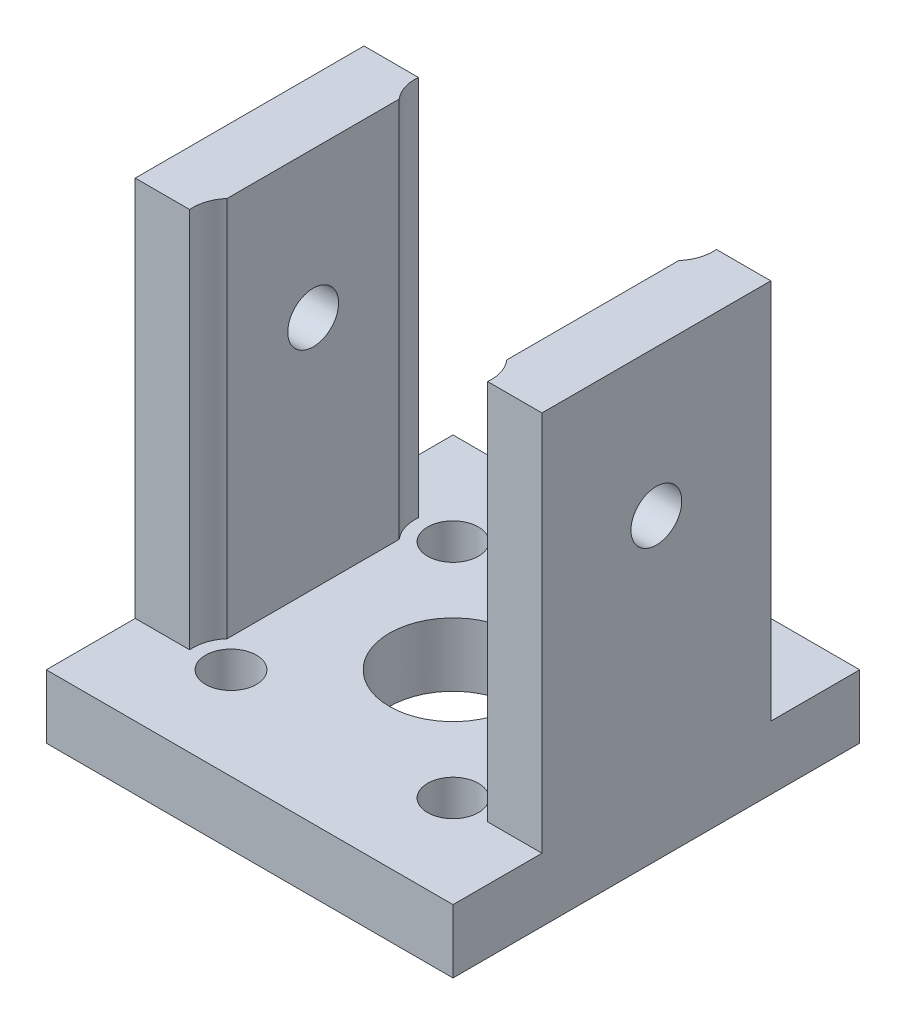
ISO-10303-21;
HEADER;
FILE_DESCRIPTION(('STEP AP214'),'2;1');
FILE_NAME('part.step','',(''),(''),'','','');
FILE_SCHEMA(('AUTOMOTIVE_DESIGN { 1 0 10303 214 1 1 1 1 }'));
ENDSEC;
DATA;
#1=APPLICATION_CONTEXT('core data for automotive mechanical design processes');
#2=APPLICATION_PROTOCOL_DEFINITION('international standard','automotive_design',2000,#1);
#3=PRODUCT_CONTEXT('',#1,'mechanical');
#4=PRODUCT('Part','Part','',(#3));
#5=PRODUCT_RELATED_PRODUCT_CATEGORY('part','',(#4));
#6=PRODUCT_DEFINITION_FORMATION('','',#4);
#7=PRODUCT_DEFINITION_CONTEXT('part definition',#1,'design');
#8=PRODUCT_DEFINITION('design','',#6,#7);
#9=PRODUCT_DEFINITION_SHAPE('','',#8);
#10=(LENGTH_UNIT() NAMED_UNIT(*) SI_UNIT(.MILLI.,.METRE.));
#11=(NAMED_UNIT(*) PLANE_ANGLE_UNIT() SI_UNIT($,.RADIAN.));
#12=(NAMED_UNIT(*) SI_UNIT($,.STERADIAN.) SOLID_ANGLE_UNIT());
#13=UNCERTAINTY_MEASURE_WITH_UNIT(LENGTH_MEASURE(1.E-05),#10,'distance_accuracy_value','');
#14=(GEOMETRIC_REPRESENTATION_CONTEXT(3) GLOBAL_UNCERTAINTY_ASSIGNED_CONTEXT((#13)) GLOBAL_UNIT_ASSIGNED_CONTEXT((#10,
#11,#12)) REPRESENTATION_CONTEXT('',''));
#15=CARTESIAN_POINT('',(0.,0.,0.));
#16=DIRECTION('',(0.,0.,1.));
#17=DIRECTION('',(1.,0.,0.));
#18=AXIS2_PLACEMENT_3D('',#15,#16,#17);
#19=CARTESIAN_POINT('',(0.,5.,0.));
#20=DIRECTION('',(0.,1.,0.));
#21=DIRECTION('',(0.,0.,1.));
#22=AXIS2_PLACEMENT_3D('',#19,#20,#21);
#23=PLANE('',#22);
#24=CARTESIAN_POINT('',(8.73276874765368,5.,7.26723125234616));
#25=DIRECTION('',(0.,1.,0.));
#26=DIRECTION('',(0.,0.,1.));
#27=AXIS2_PLACEMENT_3D('',#24,#25,#26);
#28=CIRCLE('',#27,2.00000000000035);
#29=CARTESIAN_POINT('',(8.73276874765368,5.,9.26723125234651));
#30=VERTEX_POINT('',#29);
#31=EDGE_CURVE('E564',#30,#30,#28,.T.);
#32=ORIENTED_EDGE('',*,*,#31,.F.);
#33=EDGE_LOOP('',(#32));
#34=FACE_BOUND('',#33,.T.);
#35=CARTESIAN_POINT('',(8.73276874765391,5.,24.7327687476539));
#36=DIRECTION('',(0.,1.,0.));
#37=DIRECTION('',(0.,0.,1.));
#38=AXIS2_PLACEMENT_3D('',#35,#36,#37);
#39=CIRCLE('',#38,2.);
#40=CARTESIAN_POINT('',(8.73276874765391,5.,26.7327687476539));
#41=VERTEX_POINT('',#40);
#42=EDGE_CURVE('E561',#41,#41,#39,.T.);
#43=ORIENTED_EDGE('',*,*,#42,.F.);
#44=EDGE_LOOP('',(#43));
#45=FACE_BOUND('',#44,.T.);
#46=CARTESIAN_POINT('',(-8.73276874765385,5.,24.7327687476538));
#47=DIRECTION('',(0.,1.,0.));
#48=DIRECTION('',(0.,0.,1.));
#49=AXIS2_PLACEMENT_3D('',#46,#47,#48);
#50=CIRCLE('',#49,2.);
#51=CARTESIAN_POINT('',(-8.73276874765385,5.,26.7327687476538));
#52=VERTEX_POINT('',#51);
#53=EDGE_CURVE('E558',#52,#52,#50,.T.);
#54=ORIENTED_EDGE('',*,*,#53,.F.);
#55=EDGE_LOOP('',(#54));
#56=FACE_BOUND('',#55,.T.);
#57=CARTESIAN_POINT('',(-8.73276874765404,5.,7.26723125234639));
#58=DIRECTION('',(0.,1.,0.));
#59=DIRECTION('',(0.,0.,1.));
#60=AXIS2_PLACEMENT_3D('',#57,#58,#59);
#61=CIRCLE('',#60,2.00000000000041);
#62=CARTESIAN_POINT('',(-8.73276874765404,5.,9.2672312523468));
#63=VERTEX_POINT('',#62);
#64=EDGE_CURVE('E555',#63,#63,#61,.T.);
#65=ORIENTED_EDGE('',*,*,#64,.F.);
#66=EDGE_LOOP('',(#65));
#67=FACE_BOUND('',#66,.T.);
#68=CARTESIAN_POINT('',(0.,5.,16.));
#69=DIRECTION('',(0.,1.,0.));
#70=DIRECTION('',(0.,0.,1.));
#71=AXIS2_PLACEMENT_3D('',#68,#69,#70);
#72=CIRCLE('',#71,5.);
#73=CARTESIAN_POINT('',(0.,5.,21.));
#74=VERTEX_POINT('',#73);
#75=EDGE_CURVE('E552',#74,#74,#72,.T.);
#76=ORIENTED_EDGE('',*,*,#75,.F.);
#77=EDGE_LOOP('',(#76));
#78=FACE_BOUND('',#77,.T.);
#79=DIRECTION('',(0.,0.,-1.));
#80=VECTOR('',#79,1.);
#81=CARTESIAN_POINT('',(16.,5.,0.));
#82=LINE('',#81,#80);
#83=CARTESIAN_POINT('',(16.,5.,32.));
#84=VERTEX_POINT('',#83);
#85=CARTESIAN_POINT('',(16.,5.,25.));
#86=VERTEX_POINT('',#85);
#87=EDGE_CURVE('E229',#84,#86,#82,.T.);
#88=ORIENTED_EDGE('',*,*,#87,.T.);
#89=DIRECTION('',(1.,0.,0.));
#90=VECTOR('',#89,1.);
#91=CARTESIAN_POINT('',(16.,5.,25.));
#92=LINE('',#91,#90);
#93=CARTESIAN_POINT('',(11.7257011928435,5.,25.));
#94=VERTEX_POINT('',#93);
#95=EDGE_CURVE('E579',#94,#86,#92,.T.);
#96=ORIENTED_EDGE('',*,*,#95,.F.);
#97=CARTESIAN_POINT('',(8.73723125234614,5.,24.7372312523464));
#98=DIRECTION('',(0.,-1.,0.));
#99=DIRECTION('',(0.,0.,1.));
#100=AXIS2_PLACEMENT_3D('',#97,#98,#99);
#101=CIRCLE('',#100,3.);
#102=CARTESIAN_POINT('',(11.,5.,22.7674907631852));
#103=VERTEX_POINT('',#102);
#104=EDGE_CURVE('E577',#103,#94,#101,.T.);
#105=ORIENTED_EDGE('',*,*,#104,.F.);
#106=DIRECTION('',(0.,0.,1.));
#107=VECTOR('',#106,1.);
#108=CARTESIAN_POINT('',(11.,5.,9.23697174150738));
#109=LINE('',#108,#107);
#110=CARTESIAN_POINT('',(11.,5.,9.23697174150738));
#111=VERTEX_POINT('',#110);
#112=EDGE_CURVE('E575',#111,#103,#109,.T.);
#113=ORIENTED_EDGE('',*,*,#112,.F.);
#114=CARTESIAN_POINT('',(8.73723125234596,5.,7.26723125234639));
#115=DIRECTION('',(0.,-1.,0.));
#116=DIRECTION('',(0.,0.,1.));
#117=AXIS2_PLACEMENT_3D('',#114,#115,#116);
#118=CIRCLE('',#117,3.);
#119=CARTESIAN_POINT('',(11.7253054578786,5.,7.));
#120=VERTEX_POINT('',#119);
#121=EDGE_CURVE('E172',#120,#111,#118,.T.);
#122=ORIENTED_EDGE('',*,*,#121,.F.);
#123=DIRECTION('',(-1.,0.,0.));
#124=VECTOR('',#123,1.);
#125=CARTESIAN_POINT('',(16.,5.,7.));
#126=LINE('',#125,#124);
#127=CARTESIAN_POINT('',(16.,5.,7.));
#128=VERTEX_POINT('',#127);
#129=EDGE_CURVE('E168',#128,#120,#126,.T.);
#130=ORIENTED_EDGE('',*,*,#129,.F.);
#131=CARTESIAN_POINT('',(16.,5.,0.));
#132=VERTEX_POINT('',#131);
#133=EDGE_CURVE('E228',#128,#132,#82,.T.);
#134=ORIENTED_EDGE('',*,*,#133,.T.);
#135=DIRECTION('',(-1.,0.,0.));
#136=VECTOR('',#135,1.);
#137=CARTESIAN_POINT('',(-16.,5.,0.));
#138=LINE('',#137,#136);
#139=CARTESIAN_POINT('',(-16.,5.,0.));
#140=VERTEX_POINT('',#139);
#141=EDGE_CURVE('E232',#132,#140,#138,.T.);
#142=ORIENTED_EDGE('',*,*,#141,.T.);
#143=DIRECTION('',(0.,0.,1.));
#144=VECTOR('',#143,1.);
#145=CARTESIAN_POINT('',(-16.,5.,0.));
#146=LINE('',#145,#144);
#147=CARTESIAN_POINT('',(-16.,5.,7.));
#148=VERTEX_POINT('',#147);
#149=EDGE_CURVE('E223',#140,#148,#146,.T.);
#150=ORIENTED_EDGE('',*,*,#149,.T.);
#151=DIRECTION('',(-1.,0.,0.));
#152=VECTOR('',#151,1.);
#153=CARTESIAN_POINT('',(-16.,5.,7.));
#154=LINE('',#153,#152);
#155=CARTESIAN_POINT('',(-11.7208429531867,5.,7.));
#156=VERTEX_POINT('',#155);
#157=EDGE_CURVE('E59',#156,#148,#154,.T.);
#158=ORIENTED_EDGE('',*,*,#157,.F.);
#159=CARTESIAN_POINT('',(-8.73276874765398,5.,7.26723125234672));
#160=DIRECTION('',(0.,-1.,0.));
#161=DIRECTION('',(0.,0.,1.));
#162=AXIS2_PLACEMENT_3D('',#159,#160,#161);
#163=CIRCLE('',#162,2.99999999999996);
#164=CARTESIAN_POINT('',(-11.0000000000001,5.,9.2318336162832));
#165=VERTEX_POINT('',#164);
#166=EDGE_CURVE('E202',#165,#156,#163,.T.);
#167=ORIENTED_EDGE('',*,*,#166,.F.);
#168=DIRECTION('',(0.,0.,-1.));
#169=VECTOR('',#168,1.);
#170=CARTESIAN_POINT('',(-11.,5.,9.23183361628312));
#171=LINE('',#170,#169);
#172=CARTESIAN_POINT('',(-11.,5.,22.7726288884099));
#173=VERTEX_POINT('',#172);
#174=EDGE_CURVE('E199',#173,#165,#171,.T.);
#175=ORIENTED_EDGE('',*,*,#174,.F.);
#176=CARTESIAN_POINT('',(-8.73276874765386,5.,24.7372312523464));
#177=DIRECTION('',(0.,-1.,0.));
#178=DIRECTION('',(0.,0.,1.));
#179=AXIS2_PLACEMENT_3D('',#176,#177,#178);
#180=CIRCLE('',#179,3.);
#181=CARTESIAN_POINT('',(-11.7212386881513,5.,25.));
#182=VERTEX_POINT('',#181);
#183=EDGE_CURVE('E177',#182,#173,#180,.T.);
#184=ORIENTED_EDGE('',*,*,#183,.F.);
#185=DIRECTION('',(1.,0.,0.));
#186=VECTOR('',#185,1.);
#187=CARTESIAN_POINT('',(-16.,5.,25.));
#188=LINE('',#187,#186);
#189=CARTESIAN_POINT('',(-16.,5.,25.));
#190=VERTEX_POINT('',#189);
#191=EDGE_CURVE('E174',#190,#182,#188,.T.);
#192=ORIENTED_EDGE('',*,*,#191,.F.);
#193=CARTESIAN_POINT('',(-16.,5.,32.));
#194=VERTEX_POINT('',#193);
#195=EDGE_CURVE('E226',#190,#194,#146,.T.);
#196=ORIENTED_EDGE('',*,*,#195,.T.);
#197=DIRECTION('',(1.,0.,0.));
#198=VECTOR('',#197,1.);
#199=CARTESIAN_POINT('',(-16.,5.,32.));
#200=LINE('',#199,#198);
#201=EDGE_CURVE('E225',#194,#84,#200,.T.);
#202=ORIENTED_EDGE('',*,*,#201,.T.);
#203=EDGE_LOOP('',(#88,#96,#105,#113,#122,#130,#134,#142,#150,#158,#167,#175,#184,#192,#196,#202));
#204=FACE_BOUND('',#203,.T.);
#205=ADVANCED_FACE('F35',(#34,#45,#56,#67,#78,#204),#23,.T.);
#206=CARTESIAN_POINT('',(-16.,5.,0.));
#207=DIRECTION('',(1.,0.,0.));
#208=DIRECTION('',(0.,0.,-1.));
#209=AXIS2_PLACEMENT_3D('',#206,#207,#208);
#210=PLANE('',#209);
#211=CARTESIAN_POINT('',(-16.,23.5000000000032,16.));
#212=DIRECTION('',(-1.,0.,0.));
#213=DIRECTION('',(0.,0.,1.));
#214=AXIS2_PLACEMENT_3D('',#211,#212,#213);
#215=CIRCLE('',#214,2.);
#216=CARTESIAN_POINT('',(-16.,23.5000000000032,18.));
#217=VERTEX_POINT('',#216);
#218=EDGE_CURVE('E527',#217,#217,#215,.T.);
#219=ORIENTED_EDGE('',*,*,#218,.F.);
#220=EDGE_LOOP('',(#219));
#221=FACE_BOUND('',#220,.T.);
#222=DIRECTION('',(0.,0.,1.));
#223=VECTOR('',#222,1.);
#224=CARTESIAN_POINT('',(-16.,0.,0.));
#225=LINE('',#224,#223);
#226=CARTESIAN_POINT('',(-16.,0.,0.));
#227=VERTEX_POINT('',#226);
#228=CARTESIAN_POINT('',(-16.,0.,32.));
#229=VERTEX_POINT('',#228);
#230=EDGE_CURVE('E222',#227,#229,#225,.T.);
#231=ORIENTED_EDGE('',*,*,#230,.T.);
#232=DIRECTION('',(0.,-1.,0.));
#233=VECTOR('',#232,1.);
#234=CARTESIAN_POINT('',(-16.,5.,32.));
#235=LINE('',#234,#233);
#236=EDGE_CURVE('E11',#194,#229,#235,.T.);
#237=ORIENTED_EDGE('',*,*,#236,.F.);
#238=ORIENTED_EDGE('',*,*,#195,.F.);
#239=DIRECTION('',(0.,-1.,0.));
#240=VECTOR('',#239,1.);
#241=CARTESIAN_POINT('',(-16.,35.,25.));
#242=LINE('',#241,#240);
#243=CARTESIAN_POINT('',(-16.,35.,25.));
#244=VERTEX_POINT('',#243);
#245=EDGE_CURVE('E219',#244,#190,#242,.T.);
#246=ORIENTED_EDGE('',*,*,#245,.F.);
#247=DIRECTION('',(0.,0.,1.));
#248=VECTOR('',#247,1.);
#249=CARTESIAN_POINT('',(-16.,35.,7.));
#250=LINE('',#249,#248);
#251=CARTESIAN_POINT('',(-16.,35.,7.));
#252=VERTEX_POINT('',#251);
#253=EDGE_CURVE('E183',#252,#244,#250,.T.);
#254=ORIENTED_EDGE('',*,*,#253,.F.);
#255=DIRECTION('',(0.,-1.,0.));
#256=VECTOR('',#255,1.);
#257=CARTESIAN_POINT('',(-16.,35.,7.));
#258=LINE('',#257,#256);
#259=EDGE_CURVE('E195',#252,#148,#258,.T.);
#260=ORIENTED_EDGE('',*,*,#259,.T.);
#261=ORIENTED_EDGE('',*,*,#149,.F.);
#262=DIRECTION('',(0.,-1.,0.));
#263=VECTOR('',#262,1.);
#264=CARTESIAN_POINT('',(-16.,5.,0.));
#265=LINE('',#264,#263);
#266=EDGE_CURVE('E234',#140,#227,#265,.T.);
#267=ORIENTED_EDGE('',*,*,#266,.T.);
#268=EDGE_LOOP('',(#231,#237,#238,#246,#254,#260,#261,#267));
#269=FACE_BOUND('',#268,.T.);
#270=ADVANCED_FACE('F37',(#221,#269),#210,.F.);
#271=CARTESIAN_POINT('',(-16.,5.,32.));
#272=DIRECTION('',(0.,0.,-1.));
#273=DIRECTION('',(-1.,0.,0.));
#274=AXIS2_PLACEMENT_3D('',#271,#272,#273);
#275=PLANE('',#274);
#276=DIRECTION('',(1.,0.,0.));
#277=VECTOR('',#276,1.);
#278=CARTESIAN_POINT('',(-16.,0.,32.));
#279=LINE('',#278,#277);
#280=CARTESIAN_POINT('',(16.,0.,32.));
#281=VERTEX_POINT('',#280);
#282=EDGE_CURVE('E237',#229,#281,#279,.T.);
#283=ORIENTED_EDGE('',*,*,#282,.T.);
#284=DIRECTION('',(0.,-1.,0.));
#285=VECTOR('',#284,1.);
#286=CARTESIAN_POINT('',(16.,5.,32.));
#287=LINE('',#286,#285);
#288=EDGE_CURVE('E44',#84,#281,#287,.T.);
#289=ORIENTED_EDGE('',*,*,#288,.F.);
#290=ORIENTED_EDGE('',*,*,#201,.F.);
#291=ORIENTED_EDGE('',*,*,#236,.T.);
#292=EDGE_LOOP('',(#283,#289,#290,#291));
#293=FACE_BOUND('',#292,.T.);
#294=ADVANCED_FACE('F291',(#293),#275,.F.);
#295=CARTESIAN_POINT('',(16.,5.,0.));
#296=DIRECTION('',(-1.,0.,0.));
#297=DIRECTION('',(0.,0.,1.));
#298=AXIS2_PLACEMENT_3D('',#295,#296,#297);
#299=PLANE('',#298);
#300=CARTESIAN_POINT('',(16.,23.5000000000032,16.));
#301=DIRECTION('',(-1.,0.,0.));
#302=DIRECTION('',(0.,0.,1.));
#303=AXIS2_PLACEMENT_3D('',#300,#301,#302);
#304=CIRCLE('',#303,2.);
#305=CARTESIAN_POINT('',(16.,23.5000000000032,18.));
#306=VERTEX_POINT('',#305);
#307=EDGE_CURVE('E537',#306,#306,#304,.T.);
#308=ORIENTED_EDGE('',*,*,#307,.T.);
#309=EDGE_LOOP('',(#308));
#310=FACE_BOUND('',#309,.T.);
#311=DIRECTION('',(0.,0.,-1.));
#312=VECTOR('',#311,1.);
#313=CARTESIAN_POINT('',(16.,0.,0.));
#314=LINE('',#313,#312);
#315=CARTESIAN_POINT('',(16.,0.,0.));
#316=VERTEX_POINT('',#315);
#317=EDGE_CURVE('E239',#281,#316,#314,.T.);
#318=ORIENTED_EDGE('',*,*,#317,.T.);
#319=DIRECTION('',(0.,-1.,0.));
#320=VECTOR('',#319,1.);
#321=CARTESIAN_POINT('',(16.,5.,0.));
#322=LINE('',#321,#320);
#323=EDGE_CURVE('E245',#132,#316,#322,.T.);
#324=ORIENTED_EDGE('',*,*,#323,.F.);
#325=ORIENTED_EDGE('',*,*,#133,.F.);
#326=DIRECTION('',(0.,-1.,0.));
#327=VECTOR('',#326,1.);
#328=CARTESIAN_POINT('',(16.,35.,7.));
#329=LINE('',#328,#327);
#330=CARTESIAN_POINT('',(16.,35.,7.));
#331=VERTEX_POINT('',#330);
#332=EDGE_CURVE('E51',#331,#128,#329,.T.);
#333=ORIENTED_EDGE('',*,*,#332,.F.);
#334=DIRECTION('',(0.,0.,-1.));
#335=VECTOR('',#334,1.);
#336=CARTESIAN_POINT('',(16.,35.,7.));
#337=LINE('',#336,#335);
#338=CARTESIAN_POINT('',(16.,35.,25.));
#339=VERTEX_POINT('',#338);
#340=EDGE_CURVE('E570',#339,#331,#337,.T.);
#341=ORIENTED_EDGE('',*,*,#340,.F.);
#342=DIRECTION('',(0.,-1.,0.));
#343=VECTOR('',#342,1.);
#344=CARTESIAN_POINT('',(16.,35.,25.));
#345=LINE('',#344,#343);
#346=EDGE_CURVE('E584',#339,#86,#345,.T.);
#347=ORIENTED_EDGE('',*,*,#346,.T.);
#348=ORIENTED_EDGE('',*,*,#87,.F.);
#349=ORIENTED_EDGE('',*,*,#288,.T.);
#350=EDGE_LOOP('',(#318,#324,#325,#333,#341,#347,#348,#349));
#351=FACE_BOUND('',#350,.T.);
#352=ADVANCED_FACE('F253',(#310,#351),#299,.F.);
#353=CARTESIAN_POINT('',(-16.,5.,0.));
#354=DIRECTION('',(0.,0.,1.));
#355=DIRECTION('',(1.,0.,0.));
#356=AXIS2_PLACEMENT_3D('',#353,#354,#355);
#357=PLANE('',#356);
#358=DIRECTION('',(-1.,0.,0.));
#359=VECTOR('',#358,1.);
#360=CARTESIAN_POINT('',(-16.,0.,0.));
#361=LINE('',#360,#359);
#362=EDGE_CURVE('E241',#316,#227,#361,.T.);
#363=ORIENTED_EDGE('',*,*,#362,.T.);
#364=ORIENTED_EDGE('',*,*,#266,.F.);
#365=ORIENTED_EDGE('',*,*,#141,.F.);
#366=ORIENTED_EDGE('',*,*,#323,.T.);
#367=EDGE_LOOP('',(#363,#364,#365,#366));
#368=FACE_BOUND('',#367,.T.);
#369=ADVANCED_FACE('F264',(#368),#357,.F.);
#370=CARTESIAN_POINT('',(0.,0.,0.));
#371=DIRECTION('',(0.,1.,0.));
#372=DIRECTION('',(0.,0.,1.));
#373=AXIS2_PLACEMENT_3D('',#370,#371,#372);
#374=PLANE('',#373);
#375=CARTESIAN_POINT('',(8.73276874765368,0.,7.26723125234616));
#376=DIRECTION('',(0.,-1.,0.));
#377=DIRECTION('',(0.,0.,-1.));
#378=AXIS2_PLACEMENT_3D('',#375,#376,#377);
#379=CIRCLE('',#378,2.00000000000035);
#380=CARTESIAN_POINT('',(8.73276874765368,0.,5.26723125234582));
#381=VERTEX_POINT('',#380);
#382=EDGE_CURVE('E531',#381,#381,#379,.T.);
#383=ORIENTED_EDGE('',*,*,#382,.F.);
#384=EDGE_LOOP('',(#383));
#385=FACE_BOUND('',#384,.T.);
#386=CARTESIAN_POINT('',(8.73276874765391,0.,24.7327687476539));
#387=DIRECTION('',(0.,-1.,0.));
#388=DIRECTION('',(0.,0.,-1.));
#389=AXIS2_PLACEMENT_3D('',#386,#387,#388);
#390=CIRCLE('',#389,2.);
#391=CARTESIAN_POINT('',(8.73276874765391,0.,22.7327687476539));
#392=VERTEX_POINT('',#391);
#393=EDGE_CURVE('E534',#392,#392,#390,.T.);
#394=ORIENTED_EDGE('',*,*,#393,.F.);
#395=EDGE_LOOP('',(#394));
#396=FACE_BOUND('',#395,.T.);
#397=CARTESIAN_POINT('',(-8.73276874765385,0.,24.7327687476538));
#398=DIRECTION('',(0.,-1.,0.));
#399=DIRECTION('',(0.,0.,-1.));
#400=AXIS2_PLACEMENT_3D('',#397,#398,#399);
#401=CIRCLE('',#400,2.);
#402=CARTESIAN_POINT('',(-8.73276874765385,0.,22.7327687476538));
#403=VERTEX_POINT('',#402);
#404=EDGE_CURVE('E545',#403,#403,#401,.T.);
#405=ORIENTED_EDGE('',*,*,#404,.F.);
#406=EDGE_LOOP('',(#405));
#407=FACE_BOUND('',#406,.T.);
#408=CARTESIAN_POINT('',(-8.73276874765404,0.,7.26723125234639));
#409=DIRECTION('',(0.,-1.,0.));
#410=DIRECTION('',(0.,0.,-1.));
#411=AXIS2_PLACEMENT_3D('',#408,#409,#410);
#412=CIRCLE('',#411,2.00000000000041);
#413=CARTESIAN_POINT('',(-8.73276874765404,0.,5.26723125234597));
#414=VERTEX_POINT('',#413);
#415=EDGE_CURVE('E541',#414,#414,#412,.T.);
#416=ORIENTED_EDGE('',*,*,#415,.F.);
#417=EDGE_LOOP('',(#416));
#418=FACE_BOUND('',#417,.T.);
#419=CARTESIAN_POINT('',(0.,0.,16.));
#420=DIRECTION('',(0.,-1.,0.));
#421=DIRECTION('',(0.,0.,-1.));
#422=AXIS2_PLACEMENT_3D('',#419,#420,#421);
#423=CIRCLE('',#422,5.);
#424=CARTESIAN_POINT('',(0.,0.,11.));
#425=VERTEX_POINT('',#424);
#426=EDGE_CURVE('E544',#425,#425,#423,.T.);
#427=ORIENTED_EDGE('',*,*,#426,.F.);
#428=EDGE_LOOP('',(#427));
#429=FACE_BOUND('',#428,.T.);
#430=ORIENTED_EDGE('',*,*,#230,.F.);
#431=ORIENTED_EDGE('',*,*,#362,.F.);
#432=ORIENTED_EDGE('',*,*,#317,.F.);
#433=ORIENTED_EDGE('',*,*,#282,.F.);
#434=EDGE_LOOP('',(#430,#431,#432,#433));
#435=FACE_BOUND('',#434,.T.);
#436=ADVANCED_FACE('F261',(#385,#396,#407,#418,#429,#435),#374,.F.);
#437=CARTESIAN_POINT('',(-16.,35.,25.));
#438=DIRECTION('',(0.,0.,-1.));
#439=DIRECTION('',(-1.,0.,0.));
#440=AXIS2_PLACEMENT_3D('',#437,#438,#439);
#441=PLANE('',#440);
#442=ORIENTED_EDGE('',*,*,#191,.T.);
#443=DIRECTION('',(0.,-1.,0.));
#444=VECTOR('',#443,1.);
#445=CARTESIAN_POINT('',(-11.7212386881513,35.,25.));
#446=LINE('',#445,#444);
#447=CARTESIAN_POINT('',(-11.7212386881513,35.,25.));
#448=VERTEX_POINT('',#447);
#449=EDGE_CURVE('E216',#448,#182,#446,.T.);
#450=ORIENTED_EDGE('',*,*,#449,.F.);
#451=DIRECTION('',(1.,0.,0.));
#452=VECTOR('',#451,1.);
#453=CARTESIAN_POINT('',(-16.,35.,25.));
#454=LINE('',#453,#452);
#455=EDGE_CURVE('E186',#244,#448,#454,.T.);
#456=ORIENTED_EDGE('',*,*,#455,.F.);
#457=ORIENTED_EDGE('',*,*,#245,.T.);
#458=EDGE_LOOP('',(#442,#450,#456,#457));
#459=FACE_BOUND('',#458,.T.);
#460=ADVANCED_FACE('F289',(#459),#441,.F.);
#461=CARTESIAN_POINT('',(-8.73276874765386,35.,24.7372312523464));
#462=DIRECTION('',(0.,-1.,0.));
#463=DIRECTION('',(0.,0.,-1.));
#464=AXIS2_PLACEMENT_3D('',#461,#462,#463);
#465=CYLINDRICAL_SURFACE('',#464,3.);
#466=ORIENTED_EDGE('',*,*,#183,.T.);
#467=DIRECTION('',(0.,-1.,0.));
#468=VECTOR('',#467,1.);
#469=CARTESIAN_POINT('',(-11.,35.,22.7726288884099));
#470=LINE('',#469,#468);
#471=CARTESIAN_POINT('',(-11.,35.,22.7726288884099));
#472=VERTEX_POINT('',#471);
#473=EDGE_CURVE('E213',#472,#173,#470,.T.);
#474=ORIENTED_EDGE('',*,*,#473,.F.);
#475=CARTESIAN_POINT('',(-8.73276874765386,35.,24.7372312523464));
#476=DIRECTION('',(0.,-1.,0.));
#477=DIRECTION('',(0.,0.,1.));
#478=AXIS2_PLACEMENT_3D('',#475,#476,#477);
#479=CIRCLE('',#478,3.);
#480=EDGE_CURVE('E188',#448,#472,#479,.T.);
#481=ORIENTED_EDGE('',*,*,#480,.F.);
#482=ORIENTED_EDGE('',*,*,#449,.T.);
#483=EDGE_LOOP('',(#466,#474,#481,#482));
#484=FACE_BOUND('',#483,.T.);
#485=ADVANCED_FACE('F285',(#484),#465,.F.);
#486=CARTESIAN_POINT('',(-11.,35.,9.23183361628312));
#487=DIRECTION('',(-1.,0.,0.));
#488=DIRECTION('',(0.,0.,1.));
#489=AXIS2_PLACEMENT_3D('',#486,#487,#488);
#490=PLANE('',#489);
#491=CARTESIAN_POINT('',(-11.,23.5000000000032,16.));
#492=DIRECTION('',(-1.,0.,0.));
#493=DIRECTION('',(0.,0.,1.));
#494=AXIS2_PLACEMENT_3D('',#491,#492,#493);
#495=CIRCLE('',#494,2.);
#496=CARTESIAN_POINT('',(-11.,23.5000000000032,18.));
#497=VERTEX_POINT('',#496);
#498=EDGE_CURVE('E530',#497,#497,#495,.T.);
#499=ORIENTED_EDGE('',*,*,#498,.T.);
#500=EDGE_LOOP('',(#499));
#501=FACE_BOUND('',#500,.T.);
#502=ORIENTED_EDGE('',*,*,#174,.T.);
#503=DIRECTION('',(0.,-1.,0.));
#504=VECTOR('',#503,1.);
#505=CARTESIAN_POINT('',(-11.0000000000001,35.,9.2318336162832));
#506=LINE('',#505,#504);
#507=CARTESIAN_POINT('',(-11.0000000000001,35.,9.2318336162832));
#508=VERTEX_POINT('',#507);
#509=EDGE_CURVE('E210',#508,#165,#506,.T.);
#510=ORIENTED_EDGE('',*,*,#509,.F.);
#511=DIRECTION('',(0.,0.,-1.));
#512=VECTOR('',#511,1.);
#513=CARTESIAN_POINT('',(-11.,35.,9.23183361628312));
#514=LINE('',#513,#512);
#515=EDGE_CURVE('E190',#472,#508,#514,.T.);
#516=ORIENTED_EDGE('',*,*,#515,.F.);
#517=ORIENTED_EDGE('',*,*,#473,.T.);
#518=EDGE_LOOP('',(#502,#510,#516,#517));
#519=FACE_BOUND('',#518,.T.);
#520=ADVANCED_FACE('F280',(#501,#519),#490,.F.);
#521=CARTESIAN_POINT('',(-8.73276874765398,35.,7.26723125234672));
#522=DIRECTION('',(0.,-1.,0.));
#523=DIRECTION('',(0.,0.,-1.));
#524=AXIS2_PLACEMENT_3D('',#521,#522,#523);
#525=CYLINDRICAL_SURFACE('',#524,2.99999999999996);
#526=ORIENTED_EDGE('',*,*,#166,.T.);
#527=DIRECTION('',(0.,-1.,0.));
#528=VECTOR('',#527,1.);
#529=CARTESIAN_POINT('',(-11.7208429531867,35.,7.));
#530=LINE('',#529,#528);
#531=CARTESIAN_POINT('',(-11.7208429531867,35.,7.));
#532=VERTEX_POINT('',#531);
#533=EDGE_CURVE('E207',#532,#156,#530,.T.);
#534=ORIENTED_EDGE('',*,*,#533,.F.);
#535=CARTESIAN_POINT('',(-8.73276874765398,35.,7.26723125234672));
#536=DIRECTION('',(0.,-1.,0.));
#537=DIRECTION('',(0.,0.,1.));
#538=AXIS2_PLACEMENT_3D('',#535,#536,#537);
#539=CIRCLE('',#538,2.99999999999996);
#540=EDGE_CURVE('E192',#508,#532,#539,.T.);
#541=ORIENTED_EDGE('',*,*,#540,.F.);
#542=ORIENTED_EDGE('',*,*,#509,.T.);
#543=EDGE_LOOP('',(#526,#534,#541,#542));
#544=FACE_BOUND('',#543,.T.);
#545=ADVANCED_FACE('F277',(#544),#525,.F.);
#546=CARTESIAN_POINT('',(-16.,35.,7.));
#547=DIRECTION('',(0.,0.,1.));
#548=DIRECTION('',(1.,0.,0.));
#549=AXIS2_PLACEMENT_3D('',#546,#547,#548);
#550=PLANE('',#549);
#551=ORIENTED_EDGE('',*,*,#157,.T.);
#552=ORIENTED_EDGE('',*,*,#259,.F.);
#553=DIRECTION('',(-1.,0.,0.));
#554=VECTOR('',#553,1.);
#555=CARTESIAN_POINT('',(-16.,35.,7.));
#556=LINE('',#555,#554);
#557=EDGE_CURVE('E194',#532,#252,#556,.T.);
#558=ORIENTED_EDGE('',*,*,#557,.F.);
#559=ORIENTED_EDGE('',*,*,#533,.T.);
#560=EDGE_LOOP('',(#551,#552,#558,#559));
#561=FACE_BOUND('',#560,.T.);
#562=ADVANCED_FACE('F272',(#561),#550,.F.);
#563=CARTESIAN_POINT('',(-8.73276874765386,35.,24.7372312523464));
#564=DIRECTION('',(0.,1.,0.));
#565=DIRECTION('',(0.,0.,1.));
#566=AXIS2_PLACEMENT_3D('',#563,#564,#565);
#567=PLANE('',#566);
#568=ORIENTED_EDGE('',*,*,#253,.T.);
#569=ORIENTED_EDGE('',*,*,#455,.T.);
#570=ORIENTED_EDGE('',*,*,#480,.T.);
#571=ORIENTED_EDGE('',*,*,#515,.T.);
#572=ORIENTED_EDGE('',*,*,#540,.T.);
#573=ORIENTED_EDGE('',*,*,#557,.T.);
#574=EDGE_LOOP('',(#568,#569,#570,#571,#572,#573));
#575=FACE_BOUND('',#574,.T.);
#576=ADVANCED_FACE('F353',(#575),#567,.T.);
#577=CARTESIAN_POINT('',(8.73723125234596,35.,7.26723125234639));
#578=DIRECTION('',(0.,-1.,0.));
#579=DIRECTION('',(0.,0.,-1.));
#580=AXIS2_PLACEMENT_3D('',#577,#578,#579);
#581=CYLINDRICAL_SURFACE('',#580,3.);
#582=ORIENTED_EDGE('',*,*,#121,.T.);
#583=DIRECTION('',(0.,-1.,0.));
#584=VECTOR('',#583,1.);
#585=CARTESIAN_POINT('',(11.,35.,9.23697174150738));
#586=LINE('',#585,#584);
#587=CARTESIAN_POINT('',(11.,35.,9.23697174150738));
#588=VERTEX_POINT('',#587);
#589=EDGE_CURVE('E153',#588,#111,#586,.T.);
#590=ORIENTED_EDGE('',*,*,#589,.F.);
#591=CARTESIAN_POINT('',(8.73723125234596,35.,7.26723125234639));
#592=DIRECTION('',(0.,-1.,0.));
#593=DIRECTION('',(0.,0.,1.));
#594=AXIS2_PLACEMENT_3D('',#591,#592,#593);
#595=CIRCLE('',#594,3.);
#596=CARTESIAN_POINT('',(11.7253054578786,35.,7.));
#597=VERTEX_POINT('',#596);
#598=EDGE_CURVE('E160',#597,#588,#595,.T.);
#599=ORIENTED_EDGE('',*,*,#598,.F.);
#600=DIRECTION('',(0.,-1.,0.));
#601=VECTOR('',#600,1.);
#602=CARTESIAN_POINT('',(11.7253054578786,35.,7.));
#603=LINE('',#602,#601);
#604=EDGE_CURVE('E573',#597,#120,#603,.T.);
#605=ORIENTED_EDGE('',*,*,#604,.T.);
#606=EDGE_LOOP('',(#582,#590,#599,#605));
#607=FACE_BOUND('',#606,.T.);
#608=ADVANCED_FACE('F170',(#607),#581,.F.);
#609=CARTESIAN_POINT('',(11.,35.,9.23697174150738));
#610=DIRECTION('',(1.,0.,0.));
#611=DIRECTION('',(0.,0.,-1.));
#612=AXIS2_PLACEMENT_3D('',#609,#610,#611);
#613=PLANE('',#612);
#614=CARTESIAN_POINT('',(11.,23.5000000000032,16.));
#615=DIRECTION('',(1.,0.,0.));
#616=DIRECTION('',(0.,0.,-1.));
#617=AXIS2_PLACEMENT_3D('',#614,#615,#616);
#618=CIRCLE('',#617,2.);
#619=CARTESIAN_POINT('',(11.,23.5000000000032,14.));
#620=VERTEX_POINT('',#619);
#621=EDGE_CURVE('E39',#620,#620,#618,.T.);
#622=ORIENTED_EDGE('',*,*,#621,.T.);
#623=EDGE_LOOP('',(#622));
#624=FACE_BOUND('',#623,.T.);
#625=ORIENTED_EDGE('',*,*,#112,.T.);
#626=DIRECTION('',(0.,-1.,0.));
#627=VECTOR('',#626,1.);
#628=CARTESIAN_POINT('',(11.,35.,22.7674907631852));
#629=LINE('',#628,#627);
#630=CARTESIAN_POINT('',(11.,35.,22.7674907631852));
#631=VERTEX_POINT('',#630);
#632=EDGE_CURVE('E156',#631,#103,#629,.T.);
#633=ORIENTED_EDGE('',*,*,#632,.F.);
#634=DIRECTION('',(0.,0.,1.));
#635=VECTOR('',#634,1.);
#636=CARTESIAN_POINT('',(11.,35.,9.23697174150738));
#637=LINE('',#636,#635);
#638=EDGE_CURVE('E149',#588,#631,#637,.T.);
#639=ORIENTED_EDGE('',*,*,#638,.F.);
#640=ORIENTED_EDGE('',*,*,#589,.T.);
#641=EDGE_LOOP('',(#625,#633,#639,#640));
#642=FACE_BOUND('',#641,.T.);
#643=ADVANCED_FACE('F151',(#624,#642),#613,.F.);
#644=CARTESIAN_POINT('',(8.73723125234614,35.,24.7372312523464));
#645=DIRECTION('',(0.,-1.,0.));
#646=DIRECTION('',(0.,0.,-1.));
#647=AXIS2_PLACEMENT_3D('',#644,#645,#646);
#648=CYLINDRICAL_SURFACE('',#647,3.);
#649=ORIENTED_EDGE('',*,*,#104,.T.);
#650=DIRECTION('',(0.,-1.,0.));
#651=VECTOR('',#650,1.);
#652=CARTESIAN_POINT('',(11.7257011928435,35.,25.));
#653=LINE('',#652,#651);
#654=CARTESIAN_POINT('',(11.7257011928435,35.,25.));
#655=VERTEX_POINT('',#654);
#656=EDGE_CURVE('E179',#655,#94,#653,.T.);
#657=ORIENTED_EDGE('',*,*,#656,.F.);
#658=CARTESIAN_POINT('',(8.73723125234614,35.,24.7372312523464));
#659=DIRECTION('',(0.,-1.,0.));
#660=DIRECTION('',(0.,0.,1.));
#661=AXIS2_PLACEMENT_3D('',#658,#659,#660);
#662=CIRCLE('',#661,3.);
#663=EDGE_CURVE('E159',#631,#655,#662,.T.);
#664=ORIENTED_EDGE('',*,*,#663,.F.);
#665=ORIENTED_EDGE('',*,*,#632,.T.);
#666=EDGE_LOOP('',(#649,#657,#664,#665));
#667=FACE_BOUND('',#666,.T.);
#668=ADVANCED_FACE('F373',(#667),#648,.F.);
#669=CARTESIAN_POINT('',(16.,35.,25.));
#670=DIRECTION('',(0.,0.,-1.));
#671=DIRECTION('',(-1.,0.,0.));
#672=AXIS2_PLACEMENT_3D('',#669,#670,#671);
#673=PLANE('',#672);
#674=ORIENTED_EDGE('',*,*,#95,.T.);
#675=ORIENTED_EDGE('',*,*,#346,.F.);
#676=DIRECTION('',(1.,0.,0.));
#677=VECTOR('',#676,1.);
#678=CARTESIAN_POINT('',(16.,35.,25.));
#679=LINE('',#678,#677);
#680=EDGE_CURVE('E568',#655,#339,#679,.T.);
#681=ORIENTED_EDGE('',*,*,#680,.F.);
#682=ORIENTED_EDGE('',*,*,#656,.T.);
#683=EDGE_LOOP('',(#674,#675,#681,#682));
#684=FACE_BOUND('',#683,.T.);
#685=ADVANCED_FACE('F381',(#684),#673,.F.);
#686=CARTESIAN_POINT('',(16.,35.,7.));
#687=DIRECTION('',(0.,0.,1.));
#688=DIRECTION('',(1.,0.,0.));
#689=AXIS2_PLACEMENT_3D('',#686,#687,#688);
#690=PLANE('',#689);
#691=ORIENTED_EDGE('',*,*,#129,.T.);
#692=ORIENTED_EDGE('',*,*,#604,.F.);
#693=DIRECTION('',(-1.,0.,0.));
#694=VECTOR('',#693,1.);
#695=CARTESIAN_POINT('',(16.,35.,7.));
#696=LINE('',#695,#694);
#697=EDGE_CURVE('E164',#331,#597,#696,.T.);
#698=ORIENTED_EDGE('',*,*,#697,.F.);
#699=ORIENTED_EDGE('',*,*,#332,.T.);
#700=EDGE_LOOP('',(#691,#692,#698,#699));
#701=FACE_BOUND('',#700,.T.);
#702=ADVANCED_FACE('F389',(#701),#690,.F.);
#703=CARTESIAN_POINT('',(8.73723125234596,35.,7.26723125234639));
#704=DIRECTION('',(0.,1.,0.));
#705=DIRECTION('',(0.,0.,1.));
#706=AXIS2_PLACEMENT_3D('',#703,#704,#705);
#707=PLANE('',#706);
#708=ORIENTED_EDGE('',*,*,#598,.T.);
#709=ORIENTED_EDGE('',*,*,#638,.T.);
#710=ORIENTED_EDGE('',*,*,#663,.T.);
#711=ORIENTED_EDGE('',*,*,#680,.T.);
#712=ORIENTED_EDGE('',*,*,#340,.T.);
#713=ORIENTED_EDGE('',*,*,#697,.T.);
#714=EDGE_LOOP('',(#708,#709,#710,#711,#712,#713));
#715=FACE_BOUND('',#714,.T.);
#716=ADVANCED_FACE('F163',(#715),#707,.T.);
#717=CARTESIAN_POINT('',(0.,10.,16.));
#718=DIRECTION('',(0.,-1.,0.));
#719=DIRECTION('',(0.,0.,-1.));
#720=AXIS2_PLACEMENT_3D('',#717,#718,#719);
#721=CYLINDRICAL_SURFACE('',#720,5.);
#722=ORIENTED_EDGE('',*,*,#75,.T.);
#723=EDGE_LOOP('',(#722));
#724=FACE_BOUND('',#723,.T.);
#725=ORIENTED_EDGE('',*,*,#426,.T.);
#726=EDGE_LOOP('',(#725));
#727=FACE_BOUND('',#726,.T.);
#728=ADVANCED_FACE('F403',(#724,#727),#721,.F.);
#729=CARTESIAN_POINT('',(-8.73276874765404,10.,7.26723125234639));
#730=DIRECTION('',(0.,-1.,0.));
#731=DIRECTION('',(0.,0.,-1.));
#732=AXIS2_PLACEMENT_3D('',#729,#730,#731);
#733=CYLINDRICAL_SURFACE('',#732,2.00000000000041);
#734=ORIENTED_EDGE('',*,*,#64,.T.);
#735=EDGE_LOOP('',(#734));
#736=FACE_BOUND('',#735,.T.);
#737=ORIENTED_EDGE('',*,*,#415,.T.);
#738=EDGE_LOOP('',(#737));
#739=FACE_BOUND('',#738,.T.);
#740=ADVANCED_FACE('F409',(#736,#739),#733,.F.);
#741=CARTESIAN_POINT('',(-8.73276874765385,10.,24.7327687476538));
#742=DIRECTION('',(0.,-1.,0.));
#743=DIRECTION('',(0.,0.,-1.));
#744=AXIS2_PLACEMENT_3D('',#741,#742,#743);
#745=CYLINDRICAL_SURFACE('',#744,2.);
#746=ORIENTED_EDGE('',*,*,#53,.T.);
#747=EDGE_LOOP('',(#746));
#748=FACE_BOUND('',#747,.T.);
#749=ORIENTED_EDGE('',*,*,#404,.T.);
#750=EDGE_LOOP('',(#749));
#751=FACE_BOUND('',#750,.T.);
#752=ADVANCED_FACE('F417',(#748,#751),#745,.F.);
#753=CARTESIAN_POINT('',(8.73276874765391,10.,24.7327687476539));
#754=DIRECTION('',(0.,-1.,0.));
#755=DIRECTION('',(0.,0.,-1.));
#756=AXIS2_PLACEMENT_3D('',#753,#754,#755);
#757=CYLINDRICAL_SURFACE('',#756,2.);
#758=ORIENTED_EDGE('',*,*,#42,.T.);
#759=EDGE_LOOP('',(#758));
#760=FACE_BOUND('',#759,.T.);
#761=ORIENTED_EDGE('',*,*,#393,.T.);
#762=EDGE_LOOP('',(#761));
#763=FACE_BOUND('',#762,.T.);
#764=ADVANCED_FACE('F425',(#760,#763),#757,.F.);
#765=CARTESIAN_POINT('',(8.73276874765368,10.,7.26723125234616));
#766=DIRECTION('',(0.,-1.,0.));
#767=DIRECTION('',(0.,0.,-1.));
#768=AXIS2_PLACEMENT_3D('',#765,#766,#767);
#769=CYLINDRICAL_SURFACE('',#768,2.00000000000035);
#770=ORIENTED_EDGE('',*,*,#31,.T.);
#771=EDGE_LOOP('',(#770));
#772=FACE_BOUND('',#771,.T.);
#773=ORIENTED_EDGE('',*,*,#382,.T.);
#774=EDGE_LOOP('',(#773));
#775=FACE_BOUND('',#774,.T.);
#776=ADVANCED_FACE('F433',(#772,#775),#769,.F.);
#777=CARTESIAN_POINT('',(16.,23.5000000000032,16.));
#778=DIRECTION('',(-1.,0.,0.));
#779=DIRECTION('',(0.,0.,1.));
#780=AXIS2_PLACEMENT_3D('',#777,#778,#779);
#781=CYLINDRICAL_SURFACE('',#780,2.);
#782=ORIENTED_EDGE('',*,*,#307,.F.);
#783=EDGE_LOOP('',(#782));
#784=FACE_BOUND('',#783,.T.);
#785=ORIENTED_EDGE('',*,*,#621,.F.);
#786=EDGE_LOOP('',(#785));
#787=FACE_BOUND('',#786,.T.);
#788=ADVANCED_FACE('F441',(#784,#787),#781,.F.);
#789=ORIENTED_EDGE('',*,*,#218,.T.);
#790=EDGE_LOOP('',(#789));
#791=FACE_BOUND('',#790,.T.);
#792=ORIENTED_EDGE('',*,*,#498,.F.);
#793=EDGE_LOOP('',(#792));
#794=FACE_BOUND('',#793,.T.);
#795=ADVANCED_FACE('F449',(#791,#794),#781,.F.);
#796=CLOSED_SHELL('',(#205,#270,#294,#352,#369,#436,#460,#485,#520,#545,#562,#576,#608,#643,
#668,#685,#702,#716,#728,#740,#752,#764,#776,#788,#795));
#797=MANIFOLD_SOLID_BREP('B2',#796);
#798=ADVANCED_BREP_SHAPE_REPRESENTATION('',(#18,#797),#14);
#799=SHAPE_DEFINITION_REPRESENTATION(#9,#798);
ENDSEC;
END-ISO-10303-21;
